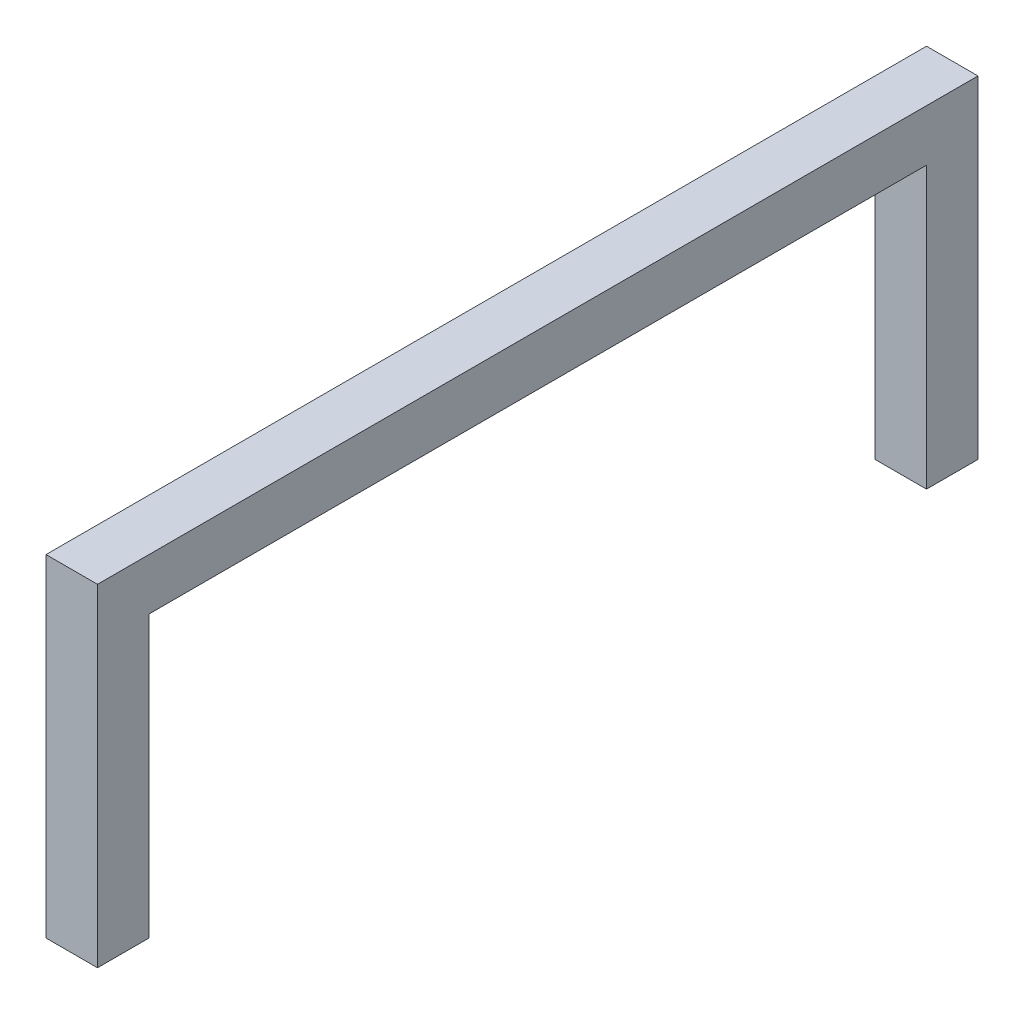
ISO-10303-21;
HEADER;
FILE_DESCRIPTION(('STEP AP214'),'2;1');
FILE_NAME('part.step','',(''),(''),'','','');
FILE_SCHEMA(('AUTOMOTIVE_DESIGN { 1 0 10303 214 1 1 1 1 }'));
ENDSEC;
DATA;
#1=APPLICATION_CONTEXT('core data for automotive mechanical design processes');
#2=APPLICATION_PROTOCOL_DEFINITION('international standard','automotive_design',2000,#1);
#3=PRODUCT_CONTEXT('',#1,'mechanical');
#4=PRODUCT('Part','Part','',(#3));
#5=PRODUCT_RELATED_PRODUCT_CATEGORY('part','',(#4));
#6=PRODUCT_DEFINITION_FORMATION('','',#4);
#7=PRODUCT_DEFINITION_CONTEXT('part definition',#1,'design');
#8=PRODUCT_DEFINITION('design','',#6,#7);
#9=PRODUCT_DEFINITION_SHAPE('','',#8);
#10=(LENGTH_UNIT() NAMED_UNIT(*) SI_UNIT(.MILLI.,.METRE.));
#11=(NAMED_UNIT(*) PLANE_ANGLE_UNIT() SI_UNIT($,.RADIAN.));
#12=(NAMED_UNIT(*) SI_UNIT($,.STERADIAN.) SOLID_ANGLE_UNIT());
#13=UNCERTAINTY_MEASURE_WITH_UNIT(LENGTH_MEASURE(1.E-05),#10,'distance_accuracy_value','');
#14=(GEOMETRIC_REPRESENTATION_CONTEXT(3) GLOBAL_UNCERTAINTY_ASSIGNED_CONTEXT((#13)) GLOBAL_UNIT_ASSIGNED_CONTEXT((#10,
#11,#12)) REPRESENTATION_CONTEXT('',''));
#15=CARTESIAN_POINT('',(0.,0.,0.));
#16=DIRECTION('',(0.,0.,1.));
#17=DIRECTION('',(1.,0.,0.));
#18=AXIS2_PLACEMENT_3D('',#15,#16,#17);
#19=CARTESIAN_POINT('',(10.,54.5,0.));
#20=DIRECTION('',(0.,1.,0.));
#21=DIRECTION('',(0.,0.,1.));
#22=AXIS2_PLACEMENT_3D('',#19,#20,#21);
#23=PLANE('',#22);
#24=DIRECTION('',(0.,0.,-1.));
#25=VECTOR('',#24,1.);
#26=CARTESIAN_POINT('',(-10.,54.5,0.));
#27=LINE('',#26,#25);
#28=CARTESIAN_POINT('',(-10.,54.5,151.));
#29=VERTEX_POINT('',#28);
#30=CARTESIAN_POINT('',(-10.,54.4999999999999,-151.));
#31=VERTEX_POINT('',#30);
#32=EDGE_CURVE('E141',#29,#31,#27,.T.);
#33=ORIENTED_EDGE('',*,*,#32,.T.);
#34=DIRECTION('',(-1.,0.,0.));
#35=VECTOR('',#34,1.);
#36=CARTESIAN_POINT('',(10.,54.4999999999999,-151.));
#37=LINE('',#36,#35);
#38=CARTESIAN_POINT('',(10.,54.4999999999999,-151.));
#39=VERTEX_POINT('',#38);
#40=EDGE_CURVE('E11',#39,#31,#37,.T.);
#41=ORIENTED_EDGE('',*,*,#40,.F.);
#42=DIRECTION('',(0.,0.,-1.));
#43=VECTOR('',#42,1.);
#44=CARTESIAN_POINT('',(10.,54.5,0.));
#45=LINE('',#44,#43);
#46=CARTESIAN_POINT('',(10.,54.5,151.));
#47=VERTEX_POINT('',#46);
#48=EDGE_CURVE('E168',#47,#39,#45,.T.);
#49=ORIENTED_EDGE('',*,*,#48,.F.);
#50=DIRECTION('',(-1.,0.,0.));
#51=VECTOR('',#50,1.);
#52=CARTESIAN_POINT('',(10.,54.5,151.));
#53=LINE('',#52,#51);
#54=EDGE_CURVE('E137',#47,#29,#53,.T.);
#55=ORIENTED_EDGE('',*,*,#54,.T.);
#56=EDGE_LOOP('',(#33,#41,#49,#55));
#57=FACE_BOUND('',#56,.T.);
#58=ADVANCED_FACE('F41',(#57),#23,.F.);
#59=CARTESIAN_POINT('',(10.,0.,-151.));
#60=DIRECTION('',(0.,0.,-1.));
#61=DIRECTION('',(0.,1.,0.));
#62=AXIS2_PLACEMENT_3D('',#59,#60,#61);
#63=PLANE('',#62);
#64=DIRECTION('',(0.,-1.,0.));
#65=VECTOR('',#64,1.);
#66=CARTESIAN_POINT('',(-10.,0.,-151.));
#67=LINE('',#66,#65);
#68=CARTESIAN_POINT('',(-10.,-54.4999999999999,-151.));
#69=VERTEX_POINT('',#68);
#70=EDGE_CURVE('E145',#31,#69,#67,.T.);
#71=ORIENTED_EDGE('',*,*,#70,.T.);
#72=DIRECTION('',(-1.,0.,0.));
#73=VECTOR('',#72,1.);
#74=CARTESIAN_POINT('',(10.,-54.4999999999999,-151.));
#75=LINE('',#74,#73);
#76=CARTESIAN_POINT('',(10.,-54.4999999999999,-151.));
#77=VERTEX_POINT('',#76);
#78=EDGE_CURVE('E50',#77,#69,#75,.T.);
#79=ORIENTED_EDGE('',*,*,#78,.F.);
#80=DIRECTION('',(0.,-1.,0.));
#81=VECTOR('',#80,1.);
#82=CARTESIAN_POINT('',(10.,0.,-151.));
#83=LINE('',#82,#81);
#84=EDGE_CURVE('E97',#39,#77,#83,.T.);
#85=ORIENTED_EDGE('',*,*,#84,.F.);
#86=ORIENTED_EDGE('',*,*,#40,.T.);
#87=EDGE_LOOP('',(#71,#79,#85,#86));
#88=FACE_BOUND('',#87,.T.);
#89=ADVANCED_FACE('F187',(#88),#63,.F.);
#90=CARTESIAN_POINT('',(10.,-54.5,0.));
#91=DIRECTION('',(0.,-1.,0.));
#92=DIRECTION('',(0.,0.,-1.));
#93=AXIS2_PLACEMENT_3D('',#90,#91,#92);
#94=PLANE('',#93);
#95=DIRECTION('',(0.,0.,1.));
#96=VECTOR('',#95,1.);
#97=CARTESIAN_POINT('',(-10.,-54.5,0.));
#98=LINE('',#97,#96);
#99=CARTESIAN_POINT('',(-10.,-54.4999999999999,-171.));
#100=VERTEX_POINT('',#99);
#101=EDGE_CURVE('E149',#100,#69,#98,.T.);
#102=ORIENTED_EDGE('',*,*,#101,.F.);
#103=DIRECTION('',(-1.,0.,0.));
#104=VECTOR('',#103,1.);
#105=CARTESIAN_POINT('',(10.,-54.4999999999999,-171.));
#106=LINE('',#105,#104);
#107=CARTESIAN_POINT('',(10.,-54.4999999999999,-171.));
#108=VERTEX_POINT('',#107);
#109=EDGE_CURVE('E178',#108,#100,#106,.T.);
#110=ORIENTED_EDGE('',*,*,#109,.F.);
#111=DIRECTION('',(0.,0.,1.));
#112=VECTOR('',#111,1.);
#113=CARTESIAN_POINT('',(10.,-54.5,0.));
#114=LINE('',#113,#112);
#115=EDGE_CURVE('E186',#108,#77,#114,.T.);
#116=ORIENTED_EDGE('',*,*,#115,.T.);
#117=ORIENTED_EDGE('',*,*,#78,.T.);
#118=EDGE_LOOP('',(#102,#110,#116,#117));
#119=FACE_BOUND('',#118,.T.);
#120=ADVANCED_FACE('F184',(#119),#94,.T.);
#121=CARTESIAN_POINT('',(10.,0.,-171.));
#122=DIRECTION('',(0.,0.,-1.));
#123=DIRECTION('',(0.,1.,0.));
#124=AXIS2_PLACEMENT_3D('',#121,#122,#123);
#125=PLANE('',#124);
#126=DIRECTION('',(0.,-1.,0.));
#127=VECTOR('',#126,1.);
#128=CARTESIAN_POINT('',(-10.,0.,-171.));
#129=LINE('',#128,#127);
#130=CARTESIAN_POINT('',(-10.,74.4999999999999,-171.));
#131=VERTEX_POINT('',#130);
#132=EDGE_CURVE('E153',#131,#100,#129,.T.);
#133=ORIENTED_EDGE('',*,*,#132,.F.);
#134=DIRECTION('',(-1.,0.,0.));
#135=VECTOR('',#134,1.);
#136=CARTESIAN_POINT('',(10.,74.4999999999999,-171.));
#137=LINE('',#136,#135);
#138=CARTESIAN_POINT('',(10.,74.4999999999999,-171.));
#139=VERTEX_POINT('',#138);
#140=EDGE_CURVE('E175',#139,#131,#137,.T.);
#141=ORIENTED_EDGE('',*,*,#140,.F.);
#142=DIRECTION('',(0.,-1.,0.));
#143=VECTOR('',#142,1.);
#144=CARTESIAN_POINT('',(10.,0.,-171.));
#145=LINE('',#144,#143);
#146=EDGE_CURVE('E197',#139,#108,#145,.T.);
#147=ORIENTED_EDGE('',*,*,#146,.T.);
#148=ORIENTED_EDGE('',*,*,#109,.T.);
#149=EDGE_LOOP('',(#133,#141,#147,#148));
#150=FACE_BOUND('',#149,.T.);
#151=ADVANCED_FACE('F195',(#150),#125,.T.);
#152=CARTESIAN_POINT('',(10.,74.4999999999999,0.));
#153=DIRECTION('',(0.,1.,0.));
#154=DIRECTION('',(0.,0.,1.));
#155=AXIS2_PLACEMENT_3D('',#152,#153,#154);
#156=PLANE('',#155);
#157=DIRECTION('',(0.,0.,-1.));
#158=VECTOR('',#157,1.);
#159=CARTESIAN_POINT('',(-10.,74.4999999999999,0.));
#160=LINE('',#159,#158);
#161=CARTESIAN_POINT('',(-10.,74.4999999999999,171.));
#162=VERTEX_POINT('',#161);
#163=EDGE_CURVE('E157',#162,#131,#160,.T.);
#164=ORIENTED_EDGE('',*,*,#163,.F.);
#165=DIRECTION('',(-1.,0.,0.));
#166=VECTOR('',#165,1.);
#167=CARTESIAN_POINT('',(10.,74.4999999999999,171.));
#168=LINE('',#167,#166);
#169=CARTESIAN_POINT('',(10.,74.4999999999999,171.));
#170=VERTEX_POINT('',#169);
#171=EDGE_CURVE('E123',#170,#162,#168,.T.);
#172=ORIENTED_EDGE('',*,*,#171,.F.);
#173=DIRECTION('',(0.,0.,-1.));
#174=VECTOR('',#173,1.);
#175=CARTESIAN_POINT('',(10.,74.4999999999999,0.));
#176=LINE('',#175,#174);
#177=EDGE_CURVE('E130',#170,#139,#176,.T.);
#178=ORIENTED_EDGE('',*,*,#177,.T.);
#179=ORIENTED_EDGE('',*,*,#140,.T.);
#180=EDGE_LOOP('',(#164,#172,#178,#179));
#181=FACE_BOUND('',#180,.T.);
#182=ADVANCED_FACE('F207',(#181),#156,.T.);
#183=CARTESIAN_POINT('',(10.,0.,171.));
#184=DIRECTION('',(0.,0.,1.));
#185=DIRECTION('',(1.,0.,0.));
#186=AXIS2_PLACEMENT_3D('',#183,#184,#185);
#187=PLANE('',#186);
#188=DIRECTION('',(0.,1.,0.));
#189=VECTOR('',#188,1.);
#190=CARTESIAN_POINT('',(-10.,0.,171.));
#191=LINE('',#190,#189);
#192=CARTESIAN_POINT('',(-10.,-54.5000000000001,171.));
#193=VERTEX_POINT('',#192);
#194=EDGE_CURVE('E117',#193,#162,#191,.T.);
#195=ORIENTED_EDGE('',*,*,#194,.F.);
#196=DIRECTION('',(-1.,0.,0.));
#197=VECTOR('',#196,1.);
#198=CARTESIAN_POINT('',(10.,-54.5000000000001,171.));
#199=LINE('',#198,#197);
#200=CARTESIAN_POINT('',(10.,-54.5000000000001,171.));
#201=VERTEX_POINT('',#200);
#202=EDGE_CURVE('E112',#201,#193,#199,.T.);
#203=ORIENTED_EDGE('',*,*,#202,.F.);
#204=DIRECTION('',(0.,1.,0.));
#205=VECTOR('',#204,1.);
#206=CARTESIAN_POINT('',(10.,0.,171.));
#207=LINE('',#206,#205);
#208=EDGE_CURVE('E115',#201,#170,#207,.T.);
#209=ORIENTED_EDGE('',*,*,#208,.T.);
#210=ORIENTED_EDGE('',*,*,#171,.T.);
#211=EDGE_LOOP('',(#195,#203,#209,#210));
#212=FACE_BOUND('',#211,.T.);
#213=ADVANCED_FACE('F114',(#212),#187,.T.);
#214=CARTESIAN_POINT('',(10.,-54.5000000000001,0.));
#215=DIRECTION('',(0.,-1.,0.));
#216=DIRECTION('',(0.,0.,-1.));
#217=AXIS2_PLACEMENT_3D('',#214,#215,#216);
#218=PLANE('',#217);
#219=DIRECTION('',(0.,0.,1.));
#220=VECTOR('',#219,1.);
#221=CARTESIAN_POINT('',(-10.,-54.5000000000001,0.));
#222=LINE('',#221,#220);
#223=CARTESIAN_POINT('',(-10.,-54.5000000000001,151.));
#224=VERTEX_POINT('',#223);
#225=EDGE_CURVE('E163',#224,#193,#222,.T.);
#226=ORIENTED_EDGE('',*,*,#225,.F.);
#227=DIRECTION('',(-1.,0.,0.));
#228=VECTOR('',#227,1.);
#229=CARTESIAN_POINT('',(10.,-54.5000000000001,151.));
#230=LINE('',#229,#228);
#231=CARTESIAN_POINT('',(10.,-54.5000000000001,151.));
#232=VERTEX_POINT('',#231);
#233=EDGE_CURVE('E86',#232,#224,#230,.T.);
#234=ORIENTED_EDGE('',*,*,#233,.F.);
#235=DIRECTION('',(0.,0.,1.));
#236=VECTOR('',#235,1.);
#237=CARTESIAN_POINT('',(10.,-54.5000000000001,0.));
#238=LINE('',#237,#236);
#239=EDGE_CURVE('E127',#232,#201,#238,.T.);
#240=ORIENTED_EDGE('',*,*,#239,.T.);
#241=ORIENTED_EDGE('',*,*,#202,.T.);
#242=EDGE_LOOP('',(#226,#234,#240,#241));
#243=FACE_BOUND('',#242,.T.);
#244=ADVANCED_FACE('F133',(#243),#218,.T.);
#245=CARTESIAN_POINT('',(10.,0.,151.));
#246=DIRECTION('',(0.,0.,1.));
#247=DIRECTION('',(1.,0.,0.));
#248=AXIS2_PLACEMENT_3D('',#245,#246,#247);
#249=PLANE('',#248);
#250=DIRECTION('',(0.,1.,0.));
#251=VECTOR('',#250,1.);
#252=CARTESIAN_POINT('',(-10.,0.,151.));
#253=LINE('',#252,#251);
#254=EDGE_CURVE('E89',#224,#29,#253,.T.);
#255=ORIENTED_EDGE('',*,*,#254,.T.);
#256=ORIENTED_EDGE('',*,*,#54,.F.);
#257=DIRECTION('',(0.,1.,0.));
#258=VECTOR('',#257,1.);
#259=CARTESIAN_POINT('',(10.,0.,151.));
#260=LINE('',#259,#258);
#261=EDGE_CURVE('E58',#232,#47,#260,.T.);
#262=ORIENTED_EDGE('',*,*,#261,.F.);
#263=ORIENTED_EDGE('',*,*,#233,.T.);
#264=EDGE_LOOP('',(#255,#256,#262,#263));
#265=FACE_BOUND('',#264,.T.);
#266=ADVANCED_FACE('F210',(#265),#249,.F.);
#267=CARTESIAN_POINT('',(10.,0.,0.));
#268=DIRECTION('',(1.,0.,0.));
#269=DIRECTION('',(0.,0.,-1.));
#270=AXIS2_PLACEMENT_3D('',#267,#268,#269);
#271=PLANE('',#270);
#272=ORIENTED_EDGE('',*,*,#48,.T.);
#273=ORIENTED_EDGE('',*,*,#84,.T.);
#274=ORIENTED_EDGE('',*,*,#115,.F.);
#275=ORIENTED_EDGE('',*,*,#146,.F.);
#276=ORIENTED_EDGE('',*,*,#177,.F.);
#277=ORIENTED_EDGE('',*,*,#208,.F.);
#278=ORIENTED_EDGE('',*,*,#239,.F.);
#279=ORIENTED_EDGE('',*,*,#261,.T.);
#280=EDGE_LOOP('',(#272,#273,#274,#275,#276,#277,#278,#279));
#281=FACE_BOUND('',#280,.T.);
#282=ADVANCED_FACE('F126',(#281),#271,.T.);
#283=CARTESIAN_POINT('',(-10.,0.,0.));
#284=DIRECTION('',(1.,0.,0.));
#285=DIRECTION('',(0.,0.,-1.));
#286=AXIS2_PLACEMENT_3D('',#283,#284,#285);
#287=PLANE('',#286);
#288=ORIENTED_EDGE('',*,*,#32,.F.);
#289=ORIENTED_EDGE('',*,*,#254,.F.);
#290=ORIENTED_EDGE('',*,*,#225,.T.);
#291=ORIENTED_EDGE('',*,*,#194,.T.);
#292=ORIENTED_EDGE('',*,*,#163,.T.);
#293=ORIENTED_EDGE('',*,*,#132,.T.);
#294=ORIENTED_EDGE('',*,*,#101,.T.);
#295=ORIENTED_EDGE('',*,*,#70,.F.);
#296=EDGE_LOOP('',(#288,#289,#290,#291,#292,#293,#294,#295));
#297=FACE_BOUND('',#296,.T.);
#298=ADVANCED_FACE('F191',(#297),#287,.F.);
#299=CLOSED_SHELL('',(#58,#89,#120,#151,#182,#213,#244,#266,#282,#298));
#300=MANIFOLD_SOLID_BREP('B2',#299);
#301=ADVANCED_BREP_SHAPE_REPRESENTATION('',(#18,#300),#14);
#302=SHAPE_DEFINITION_REPRESENTATION(#9,#301);
ENDSEC;
END-ISO-10303-21;
